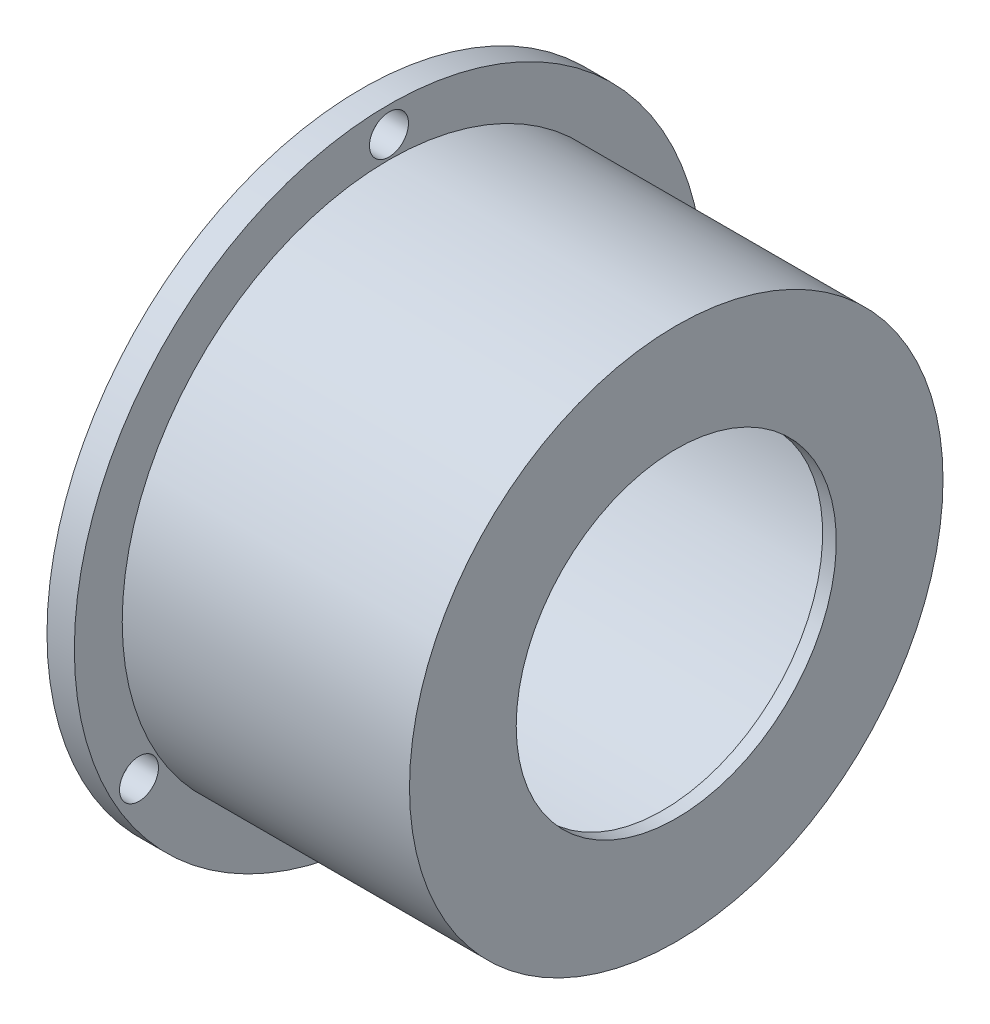
ISO-10303-21;
HEADER;
FILE_DESCRIPTION(('STEP AP214'),'2;1');
FILE_NAME('part.step','',(''),(''),'','','');
FILE_SCHEMA(('AUTOMOTIVE_DESIGN { 1 0 10303 214 1 1 1 1 }'));
ENDSEC;
DATA;
#1=APPLICATION_CONTEXT('core data for automotive mechanical design processes');
#2=APPLICATION_PROTOCOL_DEFINITION('international standard','automotive_design',2000,#1);
#3=PRODUCT_CONTEXT('',#1,'mechanical');
#4=PRODUCT('Part','Part','',(#3));
#5=PRODUCT_RELATED_PRODUCT_CATEGORY('part','',(#4));
#6=PRODUCT_DEFINITION_FORMATION('','',#4);
#7=PRODUCT_DEFINITION_CONTEXT('part definition',#1,'design');
#8=PRODUCT_DEFINITION('design','',#6,#7);
#9=PRODUCT_DEFINITION_SHAPE('','',#8);
#10=(LENGTH_UNIT() NAMED_UNIT(*) SI_UNIT(.MILLI.,.METRE.));
#11=(NAMED_UNIT(*) PLANE_ANGLE_UNIT() SI_UNIT($,.RADIAN.));
#12=(NAMED_UNIT(*) SI_UNIT($,.STERADIAN.) SOLID_ANGLE_UNIT());
#13=UNCERTAINTY_MEASURE_WITH_UNIT(LENGTH_MEASURE(1.E-05),#10,'distance_accuracy_value','');
#14=(GEOMETRIC_REPRESENTATION_CONTEXT(3) GLOBAL_UNCERTAINTY_ASSIGNED_CONTEXT((#13)) GLOBAL_UNIT_ASSIGNED_CONTEXT((#10,
#11,#12)) REPRESENTATION_CONTEXT('',''));
#15=CARTESIAN_POINT('',(0.,0.,0.));
#16=DIRECTION('',(0.,0.,1.));
#17=DIRECTION('',(1.,0.,0.));
#18=AXIS2_PLACEMENT_3D('',#15,#16,#17);
#19=CARTESIAN_POINT('',(135.7,46.,0.));
#20=DIRECTION('',(1.,0.,0.));
#21=DIRECTION('',(0.,0.,-1.));
#22=AXIS2_PLACEMENT_3D('',#19,#20,#21);
#23=PLANE('',#22);
#24=CARTESIAN_POINT('',(135.7,42.2,0.));
#25=DIRECTION('',(1.,0.,0.));
#26=DIRECTION('',(0.,0.,-1.));
#27=AXIS2_PLACEMENT_3D('',#24,#25,#26);
#28=CIRCLE('',#27,2.85);
#29=CARTESIAN_POINT('',(135.7,42.2,-2.85));
#30=VERTEX_POINT('',#29);
#31=EDGE_CURVE('E75',#30,#30,#28,.T.);
#32=ORIENTED_EDGE('',*,*,#31,.T.);
#33=EDGE_LOOP('',(#32));
#34=FACE_BOUND('',#33,.T.);
#35=CARTESIAN_POINT('',(135.7,-21.1,36.5462720397033));
#36=DIRECTION('',(1.,0.,0.));
#37=DIRECTION('',(0.,0.,-1.));
#38=AXIS2_PLACEMENT_3D('',#35,#36,#37);
#39=CIRCLE('',#38,2.85);
#40=CARTESIAN_POINT('',(135.7,-21.1,33.6962720397033));
#41=VERTEX_POINT('',#40);
#42=EDGE_CURVE('E69',#41,#41,#39,.T.);
#43=ORIENTED_EDGE('',*,*,#42,.T.);
#44=EDGE_LOOP('',(#43));
#45=FACE_BOUND('',#44,.T.);
#46=CARTESIAN_POINT('',(135.7,-21.1,-36.5462720397033));
#47=DIRECTION('',(1.,0.,0.));
#48=DIRECTION('',(0.,0.,-1.));
#49=AXIS2_PLACEMENT_3D('',#46,#47,#48);
#50=CIRCLE('',#49,2.85);
#51=CARTESIAN_POINT('',(135.7,-21.1,-39.3962720397033));
#52=VERTEX_POINT('',#51);
#53=EDGE_CURVE('E63',#52,#52,#50,.T.);
#54=ORIENTED_EDGE('',*,*,#53,.T.);
#55=EDGE_LOOP('',(#54));
#56=FACE_BOUND('',#55,.T.);
#57=CARTESIAN_POINT('',(135.7,0.,0.));
#58=DIRECTION('',(-1.,0.,0.));
#59=DIRECTION('',(0.,0.,1.));
#60=AXIS2_PLACEMENT_3D('',#57,#58,#59);
#61=CIRCLE('',#60,36.4);
#62=CARTESIAN_POINT('',(135.7,0.,36.4));
#63=VERTEX_POINT('',#62);
#64=EDGE_CURVE('E10',#63,#63,#61,.T.);
#65=ORIENTED_EDGE('',*,*,#64,.F.);
#66=EDGE_LOOP('',(#65));
#67=FACE_BOUND('',#66,.T.);
#68=CARTESIAN_POINT('',(135.7,0.,0.));
#69=DIRECTION('',(-1.,0.,0.));
#70=DIRECTION('',(0.,0.,1.));
#71=AXIS2_PLACEMENT_3D('',#68,#69,#70);
#72=CIRCLE('',#71,46.);
#73=CARTESIAN_POINT('',(135.7,0.,46.));
#74=VERTEX_POINT('',#73);
#75=EDGE_CURVE('E59',#74,#74,#72,.T.);
#76=ORIENTED_EDGE('',*,*,#75,.T.);
#77=EDGE_LOOP('',(#76));
#78=FACE_BOUND('',#77,.T.);
#79=ADVANCED_FACE('F31',(#34,#45,#56,#67,#78),#23,.F.);
#80=CARTESIAN_POINT('',(-110.,0.,0.));
#81=DIRECTION('',(-1.,0.,0.));
#82=DIRECTION('',(0.,0.,1.));
#83=AXIS2_PLACEMENT_3D('',#80,#81,#82);
#84=CYLINDRICAL_SURFACE('',#83,36.4);
#85=CARTESIAN_POINT('',(179.7,0.,0.));
#86=DIRECTION('',(-1.,0.,0.));
#87=DIRECTION('',(0.,0.,1.));
#88=AXIS2_PLACEMENT_3D('',#85,#86,#87);
#89=CIRCLE('',#88,36.4);
#90=CARTESIAN_POINT('',(179.7,0.,36.4));
#91=VERTEX_POINT('',#90);
#92=EDGE_CURVE('E37',#91,#91,#89,.T.);
#93=ORIENTED_EDGE('',*,*,#92,.F.);
#94=EDGE_LOOP('',(#93));
#95=FACE_BOUND('',#94,.T.);
#96=ORIENTED_EDGE('',*,*,#64,.T.);
#97=EDGE_LOOP('',(#96));
#98=FACE_BOUND('',#97,.T.);
#99=ADVANCED_FACE('F117',(#95,#98),#84,.F.);
#100=CARTESIAN_POINT('',(179.7,36.4,0.));
#101=DIRECTION('',(1.,0.,0.));
#102=DIRECTION('',(0.,0.,-1.));
#103=AXIS2_PLACEMENT_3D('',#100,#101,#102);
#104=PLANE('',#103);
#105=CARTESIAN_POINT('',(179.7,0.,0.));
#106=DIRECTION('',(-1.,0.,0.));
#107=DIRECTION('',(0.,0.,1.));
#108=AXIS2_PLACEMENT_3D('',#105,#106,#107);
#109=CIRCLE('',#108,23.4);
#110=CARTESIAN_POINT('',(179.7,0.,23.4));
#111=VERTEX_POINT('',#110);
#112=EDGE_CURVE('E41',#111,#111,#109,.T.);
#113=ORIENTED_EDGE('',*,*,#112,.F.);
#114=EDGE_LOOP('',(#113));
#115=FACE_BOUND('',#114,.T.);
#116=ORIENTED_EDGE('',*,*,#92,.T.);
#117=EDGE_LOOP('',(#116));
#118=FACE_BOUND('',#117,.T.);
#119=ADVANCED_FACE('F112',(#115,#118),#104,.F.);
#120=CARTESIAN_POINT('',(-110.,0.,0.));
#121=DIRECTION('',(-1.,0.,0.));
#122=DIRECTION('',(0.,0.,1.));
#123=AXIS2_PLACEMENT_3D('',#120,#121,#122);
#124=CYLINDRICAL_SURFACE('',#123,23.4);
#125=CARTESIAN_POINT('',(181.7,0.,0.));
#126=DIRECTION('',(-1.,0.,0.));
#127=DIRECTION('',(0.,0.,1.));
#128=AXIS2_PLACEMENT_3D('',#125,#126,#127);
#129=CIRCLE('',#128,23.4);
#130=CARTESIAN_POINT('',(181.7,0.,23.4));
#131=VERTEX_POINT('',#130);
#132=EDGE_CURVE('E45',#131,#131,#129,.T.);
#133=ORIENTED_EDGE('',*,*,#132,.F.);
#134=EDGE_LOOP('',(#133));
#135=FACE_BOUND('',#134,.T.);
#136=ORIENTED_EDGE('',*,*,#112,.T.);
#137=EDGE_LOOP('',(#136));
#138=FACE_BOUND('',#137,.T.);
#139=ADVANCED_FACE('F106',(#135,#138),#124,.F.);
#140=CARTESIAN_POINT('',(181.7,23.4,0.));
#141=DIRECTION('',(-1.,0.,0.));
#142=DIRECTION('',(0.,0.,1.));
#143=AXIS2_PLACEMENT_3D('',#140,#141,#142);
#144=PLANE('',#143);
#145=CARTESIAN_POINT('',(181.7,0.,0.));
#146=DIRECTION('',(-1.,0.,0.));
#147=DIRECTION('',(0.,0.,1.));
#148=AXIS2_PLACEMENT_3D('',#145,#146,#147);
#149=CIRCLE('',#148,39.);
#150=CARTESIAN_POINT('',(181.7,0.,39.));
#151=VERTEX_POINT('',#150);
#152=EDGE_CURVE('E50',#151,#151,#149,.T.);
#153=ORIENTED_EDGE('',*,*,#152,.F.);
#154=EDGE_LOOP('',(#153));
#155=FACE_BOUND('',#154,.T.);
#156=ORIENTED_EDGE('',*,*,#132,.T.);
#157=EDGE_LOOP('',(#156));
#158=FACE_BOUND('',#157,.T.);
#159=ADVANCED_FACE('F100',(#155,#158),#144,.F.);
#160=CARTESIAN_POINT('',(-110.,0.,0.));
#161=DIRECTION('',(-1.,0.,0.));
#162=DIRECTION('',(0.,0.,1.));
#163=AXIS2_PLACEMENT_3D('',#160,#161,#162);
#164=CYLINDRICAL_SURFACE('',#163,39.);
#165=CARTESIAN_POINT('',(139.7,0.,0.));
#166=DIRECTION('',(-1.,0.,0.));
#167=DIRECTION('',(0.,0.,1.));
#168=AXIS2_PLACEMENT_3D('',#165,#166,#167);
#169=CIRCLE('',#168,39.);
#170=CARTESIAN_POINT('',(139.7,0.,39.));
#171=VERTEX_POINT('',#170);
#172=EDGE_CURVE('E53',#171,#171,#169,.T.);
#173=ORIENTED_EDGE('',*,*,#172,.F.);
#174=EDGE_LOOP('',(#173));
#175=FACE_BOUND('',#174,.T.);
#176=ORIENTED_EDGE('',*,*,#152,.T.);
#177=EDGE_LOOP('',(#176));
#178=FACE_BOUND('',#177,.T.);
#179=ADVANCED_FACE('F88',(#175,#178),#164,.T.);
#180=CARTESIAN_POINT('',(139.7,39.,0.));
#181=DIRECTION('',(-1.,0.,0.));
#182=DIRECTION('',(0.,0.,1.));
#183=AXIS2_PLACEMENT_3D('',#180,#181,#182);
#184=PLANE('',#183);
#185=CARTESIAN_POINT('',(139.7,42.2,0.));
#186=DIRECTION('',(1.,0.,0.));
#187=DIRECTION('',(0.,0.,-1.));
#188=AXIS2_PLACEMENT_3D('',#185,#186,#187);
#189=CIRCLE('',#188,2.85);
#190=CARTESIAN_POINT('',(139.7,42.2,-2.85));
#191=VERTEX_POINT('',#190);
#192=EDGE_CURVE('E62',#191,#191,#189,.T.);
#193=ORIENTED_EDGE('',*,*,#192,.F.);
#194=EDGE_LOOP('',(#193));
#195=FACE_BOUND('',#194,.T.);
#196=CARTESIAN_POINT('',(139.7,-21.1,36.5462720397033));
#197=DIRECTION('',(1.,0.,0.));
#198=DIRECTION('',(0.,0.,-1.));
#199=AXIS2_PLACEMENT_3D('',#196,#197,#198);
#200=CIRCLE('',#199,2.85);
#201=CARTESIAN_POINT('',(139.7,-21.1,33.6962720397033));
#202=VERTEX_POINT('',#201);
#203=EDGE_CURVE('E72',#202,#202,#200,.T.);
#204=ORIENTED_EDGE('',*,*,#203,.F.);
#205=EDGE_LOOP('',(#204));
#206=FACE_BOUND('',#205,.T.);
#207=CARTESIAN_POINT('',(139.7,-21.1,-36.5462720397033));
#208=DIRECTION('',(1.,0.,0.));
#209=DIRECTION('',(0.,0.,-1.));
#210=AXIS2_PLACEMENT_3D('',#207,#208,#209);
#211=CIRCLE('',#210,2.85);
#212=CARTESIAN_POINT('',(139.7,-21.1,-39.3962720397033));
#213=VERTEX_POINT('',#212);
#214=EDGE_CURVE('E66',#213,#213,#211,.T.);
#215=ORIENTED_EDGE('',*,*,#214,.F.);
#216=EDGE_LOOP('',(#215));
#217=FACE_BOUND('',#216,.T.);
#218=CARTESIAN_POINT('',(139.7,0.,0.));
#219=DIRECTION('',(-1.,0.,0.));
#220=DIRECTION('',(0.,0.,1.));
#221=AXIS2_PLACEMENT_3D('',#218,#219,#220);
#222=CIRCLE('',#221,46.);
#223=CARTESIAN_POINT('',(139.7,0.,46.));
#224=VERTEX_POINT('',#223);
#225=EDGE_CURVE('E56',#224,#224,#222,.T.);
#226=ORIENTED_EDGE('',*,*,#225,.F.);
#227=EDGE_LOOP('',(#226));
#228=FACE_BOUND('',#227,.T.);
#229=ORIENTED_EDGE('',*,*,#172,.T.);
#230=EDGE_LOOP('',(#229));
#231=FACE_BOUND('',#230,.T.);
#232=ADVANCED_FACE('F84',(#195,#206,#217,#228,#231),#184,.F.);
#233=CARTESIAN_POINT('',(-110.,0.,0.));
#234=DIRECTION('',(-1.,0.,0.));
#235=DIRECTION('',(0.,0.,1.));
#236=AXIS2_PLACEMENT_3D('',#233,#234,#235);
#237=CYLINDRICAL_SURFACE('',#236,46.);
#238=ORIENTED_EDGE('',*,*,#75,.F.);
#239=EDGE_LOOP('',(#238));
#240=FACE_BOUND('',#239,.T.);
#241=ORIENTED_EDGE('',*,*,#225,.T.);
#242=EDGE_LOOP('',(#241));
#243=FACE_BOUND('',#242,.T.);
#244=ADVANCED_FACE('F87',(#240,#243),#237,.T.);
#245=CARTESIAN_POINT('',(139.7,-21.1,-36.5462720397033));
#246=DIRECTION('',(-1.,0.,0.));
#247=DIRECTION('',(0.,0.,1.));
#248=AXIS2_PLACEMENT_3D('',#245,#246,#247);
#249=CYLINDRICAL_SURFACE('',#248,2.85);
#250=ORIENTED_EDGE('',*,*,#214,.T.);
#251=EDGE_LOOP('',(#250));
#252=FACE_BOUND('',#251,.T.);
#253=ORIENTED_EDGE('',*,*,#53,.F.);
#254=EDGE_LOOP('',(#253));
#255=FACE_BOUND('',#254,.T.);
#256=ADVANCED_FACE('F138',(#252,#255),#249,.F.);
#257=CARTESIAN_POINT('',(139.7,-21.1,36.5462720397033));
#258=DIRECTION('',(-1.,0.,0.));
#259=DIRECTION('',(0.,0.,1.));
#260=AXIS2_PLACEMENT_3D('',#257,#258,#259);
#261=CYLINDRICAL_SURFACE('',#260,2.85);
#262=ORIENTED_EDGE('',*,*,#203,.T.);
#263=EDGE_LOOP('',(#262));
#264=FACE_BOUND('',#263,.T.);
#265=ORIENTED_EDGE('',*,*,#42,.F.);
#266=EDGE_LOOP('',(#265));
#267=FACE_BOUND('',#266,.T.);
#268=ADVANCED_FACE('F143',(#264,#267),#261,.F.);
#269=CARTESIAN_POINT('',(139.7,42.2,0.));
#270=DIRECTION('',(-1.,0.,0.));
#271=DIRECTION('',(0.,0.,1.));
#272=AXIS2_PLACEMENT_3D('',#269,#270,#271);
#273=CYLINDRICAL_SURFACE('',#272,2.85);
#274=ORIENTED_EDGE('',*,*,#192,.T.);
#275=EDGE_LOOP('',(#274));
#276=FACE_BOUND('',#275,.T.);
#277=ORIENTED_EDGE('',*,*,#31,.F.);
#278=EDGE_LOOP('',(#277));
#279=FACE_BOUND('',#278,.T.);
#280=ADVANCED_FACE('F81',(#276,#279),#273,.F.);
#281=CLOSED_SHELL('',(#79,#99,#119,#139,#159,#179,#232,#244,#256,#268,#280));
#282=MANIFOLD_SOLID_BREP('B2',#281);
#283=ADVANCED_BREP_SHAPE_REPRESENTATION('',(#18,#282),#14);
#284=SHAPE_DEFINITION_REPRESENTATION(#9,#283);
ENDSEC;
END-ISO-10303-21;
